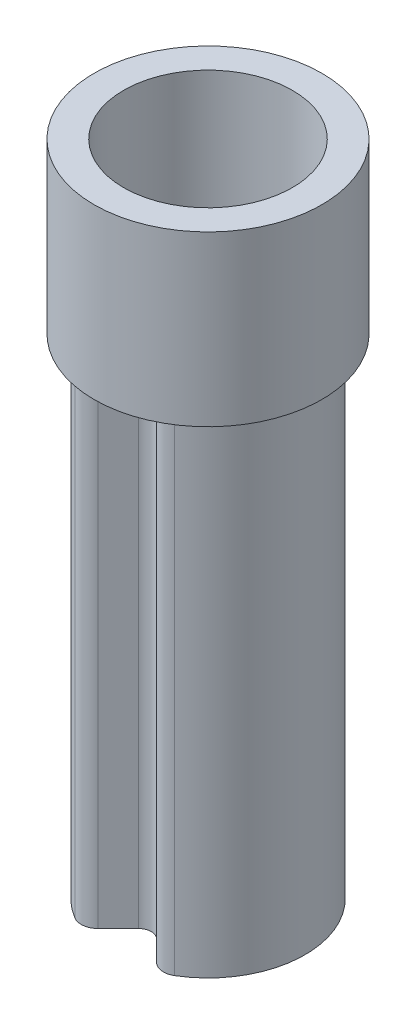
ISO-10303-21;
HEADER;
FILE_DESCRIPTION(('STEP AP214'),'2;1');
FILE_NAME('part.step','',(''),(''),'','','');
FILE_SCHEMA(('AUTOMOTIVE_DESIGN { 1 0 10303 214 1 1 1 1 }'));
ENDSEC;
DATA;
#1=APPLICATION_CONTEXT('core data for automotive mechanical design processes');
#2=APPLICATION_PROTOCOL_DEFINITION('international standard','automotive_design',2000,#1);
#3=PRODUCT_CONTEXT('',#1,'mechanical');
#4=PRODUCT('Part','Part','',(#3));
#5=PRODUCT_RELATED_PRODUCT_CATEGORY('part','',(#4));
#6=PRODUCT_DEFINITION_FORMATION('','',#4);
#7=PRODUCT_DEFINITION_CONTEXT('part definition',#1,'design');
#8=PRODUCT_DEFINITION('design','',#6,#7);
#9=PRODUCT_DEFINITION_SHAPE('','',#8);
#10=(LENGTH_UNIT() NAMED_UNIT(*) SI_UNIT(.MILLI.,.METRE.));
#11=(NAMED_UNIT(*) PLANE_ANGLE_UNIT() SI_UNIT($,.RADIAN.));
#12=(NAMED_UNIT(*) SI_UNIT($,.STERADIAN.) SOLID_ANGLE_UNIT());
#13=UNCERTAINTY_MEASURE_WITH_UNIT(LENGTH_MEASURE(1.E-05),#10,'distance_accuracy_value','');
#14=(GEOMETRIC_REPRESENTATION_CONTEXT(3) GLOBAL_UNCERTAINTY_ASSIGNED_CONTEXT((#13)) GLOBAL_UNIT_ASSIGNED_CONTEXT((#10,
#11,#12)) REPRESENTATION_CONTEXT('',''));
#15=CARTESIAN_POINT('',(0.,0.,0.));
#16=DIRECTION('',(0.,0.,1.));
#17=DIRECTION('',(1.,0.,0.));
#18=AXIS2_PLACEMENT_3D('',#15,#16,#17);
#19=CARTESIAN_POINT('',(0.,5.8,0.822132034355964));
#20=DIRECTION('',(0.,1.,0.));
#21=DIRECTION('',(0.,0.,1.));
#22=AXIS2_PLACEMENT_3D('',#19,#20,#21);
#23=PLANE('',#22);
#24=DIRECTION('',(0.707106781186548,0.,0.707106781186548));
#25=VECTOR('',#24,1.);
#26=CARTESIAN_POINT('',(0.106066017177983,5.8,0.716066017177983));
#27=LINE('',#26,#25);
#28=CARTESIAN_POINT('',(0.106066017177983,5.8,0.716066017177983));
#29=VERTEX_POINT('',#28);
#30=CARTESIAN_POINT('',(0.332945922473057,5.8,0.942945922473057));
#31=VERTEX_POINT('',#30);
#32=EDGE_CURVE('E152',#29,#31,#27,.T.);
#33=ORIENTED_EDGE('',*,*,#32,.T.);
#34=CARTESIAN_POINT('',(0.,5.8,0.));
#35=DIRECTION('',(0.,1.,0.));
#36=DIRECTION('',(0.,0.,1.));
#37=AXIS2_PLACEMENT_3D('',#34,#35,#36);
#38=CIRCLE('',#37,1.);
#39=CARTESIAN_POINT('',(0.513633561053512,5.8,0.858009653185492));
#40=VERTEX_POINT('',#39);
#41=EDGE_CURVE('E135',#31,#40,#38,.T.);
#42=ORIENTED_EDGE('',*,*,#41,.T.);
#43=CARTESIAN_POINT('',(0.487951883000837,5.8,0.815109170526217));
#44=DIRECTION('',(0.,1.,0.));
#45=DIRECTION('',(0.,0.,1.));
#46=AXIS2_PLACEMENT_3D('',#43,#44,#45);
#47=CIRCLE('',#46,0.05);
#48=CARTESIAN_POINT('',(0.452596543941509,5.8,0.850464509585545));
#49=VERTEX_POINT('',#48);
#50=EDGE_CURVE('E192',#40,#49,#47,.F.);
#51=ORIENTED_EDGE('',*,*,#50,.T.);
#52=DIRECTION('',(0.707106781186548,0.,0.707106781186547));
#53=VECTOR('',#52,1.);
#54=CARTESIAN_POINT('',(0.212132034355966,5.8,0.610000000000001));
#55=LINE('',#54,#53);
#56=CARTESIAN_POINT('',(0.212132034355966,5.8,0.610000000000002));
#57=VERTEX_POINT('',#56);
#58=EDGE_CURVE('E225',#57,#49,#55,.T.);
#59=ORIENTED_EDGE('',*,*,#58,.F.);
#60=CARTESIAN_POINT('',(0.,5.8,0.822132034355964));
#61=DIRECTION('',(0.,-1.,0.));
#62=DIRECTION('',(0.,0.,1.));
#63=AXIS2_PLACEMENT_3D('',#60,#61,#62);
#64=CIRCLE('',#63,0.3);
#65=CARTESIAN_POINT('',(-0.212132034355965,5.8,0.610000000000001));
#66=VERTEX_POINT('',#65);
#67=EDGE_CURVE('E221',#66,#57,#64,.T.);
#68=ORIENTED_EDGE('',*,*,#67,.F.);
#69=DIRECTION('',(0.707106781186547,0.,-0.707106781186548));
#70=VECTOR('',#69,1.);
#71=CARTESIAN_POINT('',(-0.479612456619358,5.8,0.877480422263394));
#72=LINE('',#71,#70);
#73=CARTESIAN_POINT('',(-0.452596543941509,5.8,0.850464509585545));
#74=VERTEX_POINT('',#73);
#75=EDGE_CURVE('E219',#74,#66,#72,.T.);
#76=ORIENTED_EDGE('',*,*,#75,.F.);
#77=CARTESIAN_POINT('',(-0.487951883000836,5.8,0.815109170526218));
#78=DIRECTION('',(0.,1.,0.));
#79=DIRECTION('',(0.,0.,1.));
#80=AXIS2_PLACEMENT_3D('',#77,#78,#79);
#81=CIRCLE('',#80,0.05);
#82=CARTESIAN_POINT('',(-0.513633561053512,5.8,0.858009653185492));
#83=VERTEX_POINT('',#82);
#84=EDGE_CURVE('E195',#74,#83,#81,.F.);
#85=ORIENTED_EDGE('',*,*,#84,.T.);
#86=CARTESIAN_POINT('',(-0.332945922473057,5.8,0.942945922473057));
#87=VERTEX_POINT('',#86);
#88=EDGE_CURVE('E12',#83,#87,#38,.T.);
#89=ORIENTED_EDGE('',*,*,#88,.T.);
#90=DIRECTION('',(0.707106781186547,0.,-0.707106781186548));
#91=VECTOR('',#90,1.);
#92=CARTESIAN_POINT('',(-0.448807004477936,5.8,1.05880700447794));
#93=LINE('',#92,#91);
#94=CARTESIAN_POINT('',(-0.106066017177983,5.8,0.716066017177983));
#95=VERTEX_POINT('',#94);
#96=EDGE_CURVE('E162',#87,#95,#93,.T.);
#97=ORIENTED_EDGE('',*,*,#96,.T.);
#98=CARTESIAN_POINT('',(0.,5.8,0.822132034355964));
#99=DIRECTION('',(0.,-1.,0.));
#100=DIRECTION('',(0.,0.,1.));
#101=AXIS2_PLACEMENT_3D('',#98,#99,#100);
#102=CIRCLE('',#101,0.15);
#103=EDGE_CURVE('E157',#95,#29,#102,.T.);
#104=ORIENTED_EDGE('',*,*,#103,.T.);
#105=EDGE_LOOP('',(#33,#42,#51,#59,#68,#76,#85,#89,#97,#104));
#106=FACE_BOUND('',#105,.T.);
#107=ADVANCED_FACE('F34',(#106),#23,.T.);
#108=CARTESIAN_POINT('',(0.,0.,0.822132034355964));
#109=DIRECTION('',(0.,1.,0.));
#110=DIRECTION('',(0.,0.,1.));
#111=AXIS2_PLACEMENT_3D('',#108,#109,#110);
#112=PLANE('',#111);
#113=CARTESIAN_POINT('',(0.,0.,0.));
#114=DIRECTION('',(0.,1.,0.));
#115=DIRECTION('',(0.,0.,1.));
#116=AXIS2_PLACEMENT_3D('',#113,#114,#115);
#117=CIRCLE('',#116,1.15);
#118=CARTESIAN_POINT('',(0.590678595211539,0.,0.986711101163316));
#119=VERTEX_POINT('',#118);
#120=CARTESIAN_POINT('',(-0.590678595211538,0.,0.986711101163316));
#121=VERTEX_POINT('',#120);
#122=EDGE_CURVE('E175',#119,#121,#117,.T.);
#123=ORIENTED_EDGE('',*,*,#122,.F.);
#124=CARTESIAN_POINT('',(0.487951883000836,0.,0.815109170526217));
#125=DIRECTION('',(0.,1.,0.));
#126=DIRECTION('',(0.,0.,1.));
#127=AXIS2_PLACEMENT_3D('',#124,#125,#126);
#128=CIRCLE('',#127,0.2);
#129=CARTESIAN_POINT('',(0.346530526763527,0.,0.956530526763527));
#130=VERTEX_POINT('',#129);
#131=EDGE_CURVE('E59',#119,#130,#128,.F.);
#132=ORIENTED_EDGE('',*,*,#131,.T.);
#133=DIRECTION('',(0.707106781186548,0.,0.707106781186548));
#134=VECTOR('',#133,1.);
#135=CARTESIAN_POINT('',(0.106066017177983,0.,0.716066017177983));
#136=LINE('',#135,#134);
#137=CARTESIAN_POINT('',(0.106066017177983,0.,0.716066017177983));
#138=VERTEX_POINT('',#137);
#139=EDGE_CURVE('E172',#138,#130,#136,.T.);
#140=ORIENTED_EDGE('',*,*,#139,.F.);
#141=CARTESIAN_POINT('',(0.,0.,0.822132034355964));
#142=DIRECTION('',(0.,-1.,0.));
#143=DIRECTION('',(0.,0.,1.));
#144=AXIS2_PLACEMENT_3D('',#141,#142,#143);
#145=CIRCLE('',#144,0.15);
#146=CARTESIAN_POINT('',(-0.106066017177983,0.,0.716066017177983));
#147=VERTEX_POINT('',#146);
#148=EDGE_CURVE('E169',#147,#138,#145,.T.);
#149=ORIENTED_EDGE('',*,*,#148,.F.);
#150=DIRECTION('',(0.707106781186547,0.,-0.707106781186548));
#151=VECTOR('',#150,1.);
#152=CARTESIAN_POINT('',(-0.448807004477936,0.,1.05880700447794));
#153=LINE('',#152,#151);
#154=CARTESIAN_POINT('',(-0.346530526763527,0.,0.956530526763527));
#155=VERTEX_POINT('',#154);
#156=EDGE_CURVE('E178',#155,#147,#153,.T.);
#157=ORIENTED_EDGE('',*,*,#156,.F.);
#158=CARTESIAN_POINT('',(-0.487951883000836,0.,0.815109170526218));
#159=DIRECTION('',(0.,1.,0.));
#160=DIRECTION('',(0.,0.,1.));
#161=AXIS2_PLACEMENT_3D('',#158,#159,#160);
#162=CIRCLE('',#161,0.2);
#163=EDGE_CURVE('E202',#155,#121,#162,.F.);
#164=ORIENTED_EDGE('',*,*,#163,.T.);
#165=EDGE_LOOP('',(#123,#132,#140,#149,#157,#164));
#166=FACE_BOUND('',#165,.T.);
#167=DIRECTION('',(0.707106781186548,0.,0.707106781186547));
#168=VECTOR('',#167,1.);
#169=CARTESIAN_POINT('',(0.212132034355966,0.,0.610000000000001));
#170=LINE('',#169,#168);
#171=CARTESIAN_POINT('',(0.212132034355966,0.,0.610000000000002));
#172=VERTEX_POINT('',#171);
#173=CARTESIAN_POINT('',(0.452596543941509,0.,0.850464509585545));
#174=VERTEX_POINT('',#173);
#175=EDGE_CURVE('E222',#172,#174,#170,.T.);
#176=ORIENTED_EDGE('',*,*,#175,.T.);
#177=CARTESIAN_POINT('',(0.487951883000837,0.,0.815109170526217));
#178=DIRECTION('',(0.,1.,0.));
#179=DIRECTION('',(0.,0.,1.));
#180=AXIS2_PLACEMENT_3D('',#177,#178,#179);
#181=CIRCLE('',#180,0.05);
#182=CARTESIAN_POINT('',(0.513633561053512,0.,0.858009653185492));
#183=VERTEX_POINT('',#182);
#184=EDGE_CURVE('E190',#174,#183,#181,.T.);
#185=ORIENTED_EDGE('',*,*,#184,.T.);
#186=CARTESIAN_POINT('',(0.,0.,0.));
#187=DIRECTION('',(0.,1.,0.));
#188=DIRECTION('',(0.,0.,1.));
#189=AXIS2_PLACEMENT_3D('',#186,#187,#188);
#190=CIRCLE('',#189,1.);
#191=CARTESIAN_POINT('',(-0.513633561053512,0.,0.858009653185492));
#192=VERTEX_POINT('',#191);
#193=EDGE_CURVE('E229',#183,#192,#190,.T.);
#194=ORIENTED_EDGE('',*,*,#193,.T.);
#195=CARTESIAN_POINT('',(-0.487951883000836,0.,0.815109170526218));
#196=DIRECTION('',(0.,1.,0.));
#197=DIRECTION('',(0.,0.,1.));
#198=AXIS2_PLACEMENT_3D('',#195,#196,#197);
#199=CIRCLE('',#198,0.05);
#200=CARTESIAN_POINT('',(-0.452596543941509,0.,0.850464509585545));
#201=VERTEX_POINT('',#200);
#202=EDGE_CURVE('E193',#192,#201,#199,.T.);
#203=ORIENTED_EDGE('',*,*,#202,.T.);
#204=DIRECTION('',(0.707106781186547,0.,-0.707106781186548));
#205=VECTOR('',#204,1.);
#206=CARTESIAN_POINT('',(-0.479612456619358,0.,0.877480422263394));
#207=LINE('',#206,#205);
#208=CARTESIAN_POINT('',(-0.212132034355965,0.,0.610000000000001));
#209=VERTEX_POINT('',#208);
#210=EDGE_CURVE('E232',#201,#209,#207,.T.);
#211=ORIENTED_EDGE('',*,*,#210,.T.);
#212=CARTESIAN_POINT('',(0.,0.,0.822132034355964));
#213=DIRECTION('',(0.,-1.,0.));
#214=DIRECTION('',(0.,0.,1.));
#215=AXIS2_PLACEMENT_3D('',#212,#213,#214);
#216=CIRCLE('',#215,0.3);
#217=EDGE_CURVE('E235',#209,#172,#216,.T.);
#218=ORIENTED_EDGE('',*,*,#217,.T.);
#219=EDGE_LOOP('',(#176,#185,#194,#203,#211,#218));
#220=FACE_BOUND('',#219,.T.);
#221=ADVANCED_FACE('F253',(#166,#220),#112,.F.);
#222=CARTESIAN_POINT('',(0.,5.8,0.822132034355964));
#223=DIRECTION('',(0.,-1.,0.));
#224=DIRECTION('',(0.,0.,-1.));
#225=AXIS2_PLACEMENT_3D('',#222,#223,#224);
#226=CYLINDRICAL_SURFACE('',#225,0.15);
#227=ORIENTED_EDGE('',*,*,#148,.T.);
#228=DIRECTION('',(0.,-1.,0.));
#229=VECTOR('',#228,1.);
#230=CARTESIAN_POINT('',(0.106066017177983,5.8,0.716066017177983));
#231=LINE('',#230,#229);
#232=EDGE_CURVE('E182',#29,#138,#231,.T.);
#233=ORIENTED_EDGE('',*,*,#232,.F.);
#234=ORIENTED_EDGE('',*,*,#103,.F.);
#235=DIRECTION('',(0.,-1.,0.));
#236=VECTOR('',#235,1.);
#237=CARTESIAN_POINT('',(-0.106066017177983,5.8,0.716066017177983));
#238=LINE('',#237,#236);
#239=EDGE_CURVE('E168',#95,#147,#238,.T.);
#240=ORIENTED_EDGE('',*,*,#239,.T.);
#241=EDGE_LOOP('',(#227,#233,#234,#240));
#242=FACE_BOUND('',#241,.T.);
#243=ADVANCED_FACE('F289',(#242),#226,.F.);
#244=CARTESIAN_POINT('',(0.106066017177983,5.8,0.716066017177983));
#245=DIRECTION('',(0.707106781186547,0.,-0.707106781186547));
#246=DIRECTION('',(-0.707106781186548,0.,-0.707106781186548));
#247=AXIS2_PLACEMENT_3D('',#244,#245,#246);
#248=PLANE('',#247);
#249=ORIENTED_EDGE('',*,*,#139,.T.);
#250=DIRECTION('',(0.,-1.,0.));
#251=VECTOR('',#250,1.);
#252=CARTESIAN_POINT('',(0.346530526763527,5.8,0.956530526763527));
#253=LINE('',#252,#251);
#254=CARTESIAN_POINT('',(0.346530526763527,5.8,0.956530526763527));
#255=VERTEX_POINT('',#254);
#256=EDGE_CURVE('E155',#130,#255,#253,.F.);
#257=ORIENTED_EDGE('',*,*,#256,.T.);
#258=EDGE_CURVE('E131',#31,#255,#27,.T.);
#259=ORIENTED_EDGE('',*,*,#258,.F.);
#260=ORIENTED_EDGE('',*,*,#32,.F.);
#261=ORIENTED_EDGE('',*,*,#232,.T.);
#262=EDGE_LOOP('',(#249,#257,#259,#260,#261));
#263=FACE_BOUND('',#262,.T.);
#264=ADVANCED_FACE('F150',(#263),#248,.F.);
#265=CARTESIAN_POINT('',(0.,5.8,0.));
#266=DIRECTION('',(0.,-1.,0.));
#267=DIRECTION('',(0.,0.,-1.));
#268=AXIS2_PLACEMENT_3D('',#265,#266,#267);
#269=CYLINDRICAL_SURFACE('',#268,1.15);
#270=CARTESIAN_POINT('',(0.,5.8,0.));
#271=DIRECTION('',(0.,1.,0.));
#272=DIRECTION('',(0.,0.,1.));
#273=AXIS2_PLACEMENT_3D('',#270,#271,#272);
#274=CIRCLE('',#273,1.15);
#275=CARTESIAN_POINT('',(0.590678595211539,5.8,0.986711101163316));
#276=VERTEX_POINT('',#275);
#277=CARTESIAN_POINT('',(-0.590678595211538,5.8,0.986711101163316));
#278=VERTEX_POINT('',#277);
#279=EDGE_CURVE('E161',#276,#278,#274,.T.);
#280=ORIENTED_EDGE('',*,*,#279,.F.);
#281=DIRECTION('',(0.,-1.,0.));
#282=VECTOR('',#281,1.);
#283=CARTESIAN_POINT('',(0.590678595211539,5.8,0.986711101163316));
#284=LINE('',#283,#282);
#285=EDGE_CURVE('E199',#276,#119,#284,.T.);
#286=ORIENTED_EDGE('',*,*,#285,.T.);
#287=ORIENTED_EDGE('',*,*,#122,.T.);
#288=DIRECTION('',(0.,-1.,0.));
#289=VECTOR('',#288,1.);
#290=CARTESIAN_POINT('',(-0.590678595211539,5.8,0.986711101163316));
#291=LINE('',#290,#289);
#292=EDGE_CURVE('E196',#121,#278,#291,.F.);
#293=ORIENTED_EDGE('',*,*,#292,.T.);
#294=EDGE_LOOP('',(#280,#286,#287,#293));
#295=FACE_BOUND('',#294,.T.);
#296=ADVANCED_FACE('F297',(#295),#269,.T.);
#297=CARTESIAN_POINT('',(-0.448807004477936,5.8,1.05880700447794));
#298=DIRECTION('',(-0.707106781186548,0.,-0.707106781186547));
#299=DIRECTION('',(-0.707106781186547,0.,0.707106781186548));
#300=AXIS2_PLACEMENT_3D('',#297,#298,#299);
#301=PLANE('',#300);
#302=CARTESIAN_POINT('',(-0.346530526763527,5.8,0.956530526763527));
#303=VERTEX_POINT('',#302);
#304=EDGE_CURVE('E134',#303,#87,#93,.T.);
#305=ORIENTED_EDGE('',*,*,#304,.F.);
#306=DIRECTION('',(0.,-1.,0.));
#307=VECTOR('',#306,1.);
#308=CARTESIAN_POINT('',(-0.346530526763527,5.8,0.956530526763527));
#309=LINE('',#308,#307);
#310=EDGE_CURVE('E43',#303,#155,#309,.T.);
#311=ORIENTED_EDGE('',*,*,#310,.T.);
#312=ORIENTED_EDGE('',*,*,#156,.T.);
#313=ORIENTED_EDGE('',*,*,#239,.F.);
#314=ORIENTED_EDGE('',*,*,#96,.F.);
#315=EDGE_LOOP('',(#305,#311,#312,#313,#314));
#316=FACE_BOUND('',#315,.T.);
#317=ADVANCED_FACE('F294',(#316),#301,.F.);
#318=CARTESIAN_POINT('',(0.,5.8,0.));
#319=DIRECTION('',(0.,-1.,0.));
#320=DIRECTION('',(0.,0.,-1.));
#321=AXIS2_PLACEMENT_3D('',#318,#319,#320);
#322=CYLINDRICAL_SURFACE('',#321,1.);
#323=ORIENTED_EDGE('',*,*,#193,.F.);
#324=DIRECTION('',(0.,-1.,0.));
#325=VECTOR('',#324,1.);
#326=CARTESIAN_POINT('',(0.513633561053512,5.8,0.858009653185492));
#327=LINE('',#326,#325);
#328=EDGE_CURVE('E143',#183,#40,#327,.F.);
#329=ORIENTED_EDGE('',*,*,#328,.T.);
#330=ORIENTED_EDGE('',*,*,#41,.F.);
#331=EDGE_CURVE('E51',#87,#31,#38,.T.);
#332=ORIENTED_EDGE('',*,*,#331,.F.);
#333=ORIENTED_EDGE('',*,*,#88,.F.);
#334=DIRECTION('',(0.,-1.,0.));
#335=VECTOR('',#334,1.);
#336=CARTESIAN_POINT('',(-0.513633561053512,5.8,0.858009653185492));
#337=LINE('',#336,#335);
#338=EDGE_CURVE('E187',#83,#192,#337,.T.);
#339=ORIENTED_EDGE('',*,*,#338,.T.);
#340=EDGE_LOOP('',(#323,#329,#330,#332,#333,#339));
#341=FACE_BOUND('',#340,.T.);
#342=CARTESIAN_POINT('',(0.,7.8,0.));
#343=DIRECTION('',(0.,1.,0.));
#344=DIRECTION('',(0.,0.,1.));
#345=AXIS2_PLACEMENT_3D('',#342,#343,#344);
#346=CIRCLE('',#345,1.);
#347=CARTESIAN_POINT('',(0.,7.8,1.));
#348=VERTEX_POINT('',#347);
#349=EDGE_CURVE('E136',#348,#348,#346,.T.);
#350=ORIENTED_EDGE('',*,*,#349,.T.);
#351=EDGE_LOOP('',(#350));
#352=FACE_BOUND('',#351,.T.);
#353=ADVANCED_FACE('F140',(#341,#352),#322,.F.);
#354=CARTESIAN_POINT('',(-0.479612456619358,5.8,0.877480422263394));
#355=DIRECTION('',(-0.707106781186548,0.,-0.707106781186547));
#356=DIRECTION('',(-0.707106781186547,0.,0.707106781186548));
#357=AXIS2_PLACEMENT_3D('',#354,#355,#356);
#358=PLANE('',#357);
#359=ORIENTED_EDGE('',*,*,#210,.F.);
#360=DIRECTION('',(0.,1.,0.));
#361=VECTOR('',#360,1.);
#362=CARTESIAN_POINT('',(-0.452596543941509,5.8,0.850464509585545));
#363=LINE('',#362,#361);
#364=EDGE_CURVE('E188',#201,#74,#363,.T.);
#365=ORIENTED_EDGE('',*,*,#364,.T.);
#366=ORIENTED_EDGE('',*,*,#75,.T.);
#367=DIRECTION('',(0.,-1.,0.));
#368=VECTOR('',#367,1.);
#369=CARTESIAN_POINT('',(-0.212132034355965,5.8,0.610000000000001));
#370=LINE('',#369,#368);
#371=EDGE_CURVE('E173',#66,#209,#370,.T.);
#372=ORIENTED_EDGE('',*,*,#371,.T.);
#373=EDGE_LOOP('',(#359,#365,#366,#372));
#374=FACE_BOUND('',#373,.T.);
#375=ADVANCED_FACE('F245',(#374),#358,.T.);
#376=CARTESIAN_POINT('',(0.,5.8,0.822132034355964));
#377=DIRECTION('',(0.,-1.,0.));
#378=DIRECTION('',(0.,0.,-1.));
#379=AXIS2_PLACEMENT_3D('',#376,#377,#378);
#380=CYLINDRICAL_SURFACE('',#379,0.3);
#381=ORIENTED_EDGE('',*,*,#217,.F.);
#382=ORIENTED_EDGE('',*,*,#371,.F.);
#383=ORIENTED_EDGE('',*,*,#67,.T.);
#384=DIRECTION('',(0.,-1.,0.));
#385=VECTOR('',#384,1.);
#386=CARTESIAN_POINT('',(0.212132034355966,5.8,0.610000000000002));
#387=LINE('',#386,#385);
#388=EDGE_CURVE('E228',#57,#172,#387,.T.);
#389=ORIENTED_EDGE('',*,*,#388,.T.);
#390=EDGE_LOOP('',(#381,#382,#383,#389));
#391=FACE_BOUND('',#390,.T.);
#392=ADVANCED_FACE('F250',(#391),#380,.T.);
#393=CARTESIAN_POINT('',(0.212132034355966,5.8,0.610000000000001));
#394=DIRECTION('',(0.707106781186547,0.,-0.707106781186548));
#395=DIRECTION('',(-0.707106781186548,0.,-0.707106781186547));
#396=AXIS2_PLACEMENT_3D('',#393,#394,#395);
#397=PLANE('',#396);
#398=ORIENTED_EDGE('',*,*,#58,.T.);
#399=DIRECTION('',(0.,1.,0.));
#400=VECTOR('',#399,1.);
#401=CARTESIAN_POINT('',(0.452596543941509,0.,0.850464509585545));
#402=LINE('',#401,#400);
#403=EDGE_CURVE('E184',#49,#174,#402,.F.);
#404=ORIENTED_EDGE('',*,*,#403,.T.);
#405=ORIENTED_EDGE('',*,*,#175,.F.);
#406=ORIENTED_EDGE('',*,*,#388,.F.);
#407=EDGE_LOOP('',(#398,#404,#405,#406));
#408=FACE_BOUND('',#407,.T.);
#409=ADVANCED_FACE('F272',(#408),#397,.T.);
#410=CARTESIAN_POINT('',(0.487951883000837,5.8,0.815109170526217));
#411=DIRECTION('',(0.,-1.,0.));
#412=DIRECTION('',(0.,0.,-1.));
#413=AXIS2_PLACEMENT_3D('',#410,#411,#412);
#414=CYLINDRICAL_SURFACE('',#413,0.05);
#415=ORIENTED_EDGE('',*,*,#50,.F.);
#416=ORIENTED_EDGE('',*,*,#328,.F.);
#417=ORIENTED_EDGE('',*,*,#184,.F.);
#418=ORIENTED_EDGE('',*,*,#403,.F.);
#419=EDGE_LOOP('',(#415,#416,#417,#418));
#420=FACE_BOUND('',#419,.T.);
#421=ADVANCED_FACE('F273',(#420),#414,.F.);
#422=CARTESIAN_POINT('',(-0.487951883000836,5.8,0.815109170526218));
#423=DIRECTION('',(0.,-1.,0.));
#424=DIRECTION('',(0.,0.,-1.));
#425=AXIS2_PLACEMENT_3D('',#422,#423,#424);
#426=CYLINDRICAL_SURFACE('',#425,0.05);
#427=ORIENTED_EDGE('',*,*,#84,.F.);
#428=ORIENTED_EDGE('',*,*,#364,.F.);
#429=ORIENTED_EDGE('',*,*,#202,.F.);
#430=ORIENTED_EDGE('',*,*,#338,.F.);
#431=EDGE_LOOP('',(#427,#428,#429,#430));
#432=FACE_BOUND('',#431,.T.);
#433=ADVANCED_FACE('F258',(#432),#426,.F.);
#434=CARTESIAN_POINT('',(0.487951883000836,5.8,0.815109170526217));
#435=DIRECTION('',(0.,-1.,0.));
#436=DIRECTION('',(0.,0.,-1.));
#437=AXIS2_PLACEMENT_3D('',#434,#435,#436);
#438=CYLINDRICAL_SURFACE('',#437,0.2);
#439=CARTESIAN_POINT('',(0.487951883000836,5.8,0.815109170526217));
#440=DIRECTION('',(0.,1.,0.));
#441=DIRECTION('',(0.,0.,1.));
#442=AXIS2_PLACEMENT_3D('',#439,#440,#441);
#443=CIRCLE('',#442,0.2);
#444=EDGE_CURVE('E208',#255,#276,#443,.T.);
#445=ORIENTED_EDGE('',*,*,#444,.F.);
#446=ORIENTED_EDGE('',*,*,#256,.F.);
#447=ORIENTED_EDGE('',*,*,#131,.F.);
#448=ORIENTED_EDGE('',*,*,#285,.F.);
#449=EDGE_LOOP('',(#445,#446,#447,#448));
#450=FACE_BOUND('',#449,.T.);
#451=ADVANCED_FACE('F280',(#450),#438,.T.);
#452=CARTESIAN_POINT('',(-0.487951883000836,5.8,0.815109170526218));
#453=DIRECTION('',(0.,-1.,0.));
#454=DIRECTION('',(0.,0.,-1.));
#455=AXIS2_PLACEMENT_3D('',#452,#453,#454);
#456=CYLINDRICAL_SURFACE('',#455,0.2);
#457=CARTESIAN_POINT('',(-0.487951883000836,5.8,0.815109170526218));
#458=DIRECTION('',(0.,1.,0.));
#459=DIRECTION('',(0.,0.,1.));
#460=AXIS2_PLACEMENT_3D('',#457,#458,#459);
#461=CIRCLE('',#460,0.2);
#462=EDGE_CURVE('E206',#278,#303,#461,.T.);
#463=ORIENTED_EDGE('',*,*,#462,.F.);
#464=ORIENTED_EDGE('',*,*,#292,.F.);
#465=ORIENTED_EDGE('',*,*,#163,.F.);
#466=ORIENTED_EDGE('',*,*,#310,.F.);
#467=EDGE_LOOP('',(#463,#464,#465,#466));
#468=FACE_BOUND('',#467,.T.);
#469=ADVANCED_FACE('F36',(#468),#456,.T.);
#470=CARTESIAN_POINT('',(0.,5.8,0.));
#471=DIRECTION('',(0.,1.,0.));
#472=DIRECTION('',(0.,0.,1.));
#473=AXIS2_PLACEMENT_3D('',#470,#471,#472);
#474=PLANE('',#473);
#475=CARTESIAN_POINT('',(0.,5.8,0.));
#476=DIRECTION('',(0.,1.,0.));
#477=DIRECTION('',(0.,0.,1.));
#478=AXIS2_PLACEMENT_3D('',#475,#476,#477);
#479=CIRCLE('',#478,1.35);
#480=CARTESIAN_POINT('',(0.,5.8,-1.35));
#481=VERTEX_POINT('',#480);
#482=EDGE_CURVE('E147',#481,#481,#479,.T.);
#483=ORIENTED_EDGE('',*,*,#482,.F.);
#484=EDGE_LOOP('',(#483));
#485=FACE_BOUND('',#484,.T.);
#486=ORIENTED_EDGE('',*,*,#331,.T.);
#487=ORIENTED_EDGE('',*,*,#258,.T.);
#488=ORIENTED_EDGE('',*,*,#444,.T.);
#489=ORIENTED_EDGE('',*,*,#279,.T.);
#490=ORIENTED_EDGE('',*,*,#462,.T.);
#491=ORIENTED_EDGE('',*,*,#304,.T.);
#492=EDGE_LOOP('',(#486,#487,#488,#489,#490,#491));
#493=FACE_BOUND('',#492,.T.);
#494=ADVANCED_FACE('F129',(#485,#493),#474,.F.);
#495=CARTESIAN_POINT('',(0.,19.4183766184074,0.));
#496=DIRECTION('',(0.,-1.,0.));
#497=DIRECTION('',(0.,0.,-1.));
#498=AXIS2_PLACEMENT_3D('',#495,#496,#497);
#499=CYLINDRICAL_SURFACE('',#498,1.35);
#500=CARTESIAN_POINT('',(0.,7.8,0.));
#501=DIRECTION('',(0.,1.,0.));
#502=DIRECTION('',(0.,0.,1.));
#503=AXIS2_PLACEMENT_3D('',#500,#501,#502);
#504=CIRCLE('',#503,1.35);
#505=CARTESIAN_POINT('',(0.,7.8,-1.35));
#506=VERTEX_POINT('',#505);
#507=EDGE_CURVE('E233',#506,#506,#504,.T.);
#508=CARTESIAN_POINT('',(0.,5.8,-1.35));
#509=CARTESIAN_POINT('',(0.,5.82083333333333,-1.35));
#510=CARTESIAN_POINT('',(0.,5.84166666666666,-1.35));
#511=CARTESIAN_POINT('',(0.,5.88333333333333,-1.35));
#512=CARTESIAN_POINT('',(0.,5.90416666666666,-1.35));
#513=CARTESIAN_POINT('',(0.,5.94583333333333,-1.35));
#514=CARTESIAN_POINT('',(0.,5.96666666666666,-1.35));
#515=CARTESIAN_POINT('',(0.,6.00833333333333,-1.35));
#516=CARTESIAN_POINT('',(0.,6.02916666666666,-1.35));
#517=CARTESIAN_POINT('',(0.,6.07083333333333,-1.35));
#518=CARTESIAN_POINT('',(0.,6.09166666666666,-1.35));
#519=CARTESIAN_POINT('',(0.,6.13333333333333,-1.35));
#520=CARTESIAN_POINT('',(0.,6.15416666666666,-1.35));
#521=CARTESIAN_POINT('',(0.,6.19583333333333,-1.35));
#522=CARTESIAN_POINT('',(0.,6.21666666666667,-1.35));
#523=CARTESIAN_POINT('',(0.,6.25833333333333,-1.35));
#524=CARTESIAN_POINT('',(0.,6.27916666666667,-1.35));
#525=CARTESIAN_POINT('',(0.,6.32083333333333,-1.35));
#526=CARTESIAN_POINT('',(0.,6.34166666666667,-1.35));
#527=CARTESIAN_POINT('',(0.,6.38333333333333,-1.35));
#528=CARTESIAN_POINT('',(0.,6.40416666666667,-1.35));
#529=CARTESIAN_POINT('',(0.,6.44583333333333,-1.35));
#530=CARTESIAN_POINT('',(0.,6.46666666666667,-1.35));
#531=CARTESIAN_POINT('',(0.,6.50833333333333,-1.35));
#532=CARTESIAN_POINT('',(0.,6.52916666666667,-1.35));
#533=CARTESIAN_POINT('',(0.,6.57083333333333,-1.35));
#534=CARTESIAN_POINT('',(0.,6.59166666666667,-1.35));
#535=CARTESIAN_POINT('',(0.,6.63333333333333,-1.35));
#536=CARTESIAN_POINT('',(0.,6.65416666666667,-1.35));
#537=CARTESIAN_POINT('',(0.,6.69583333333333,-1.35));
#538=CARTESIAN_POINT('',(0.,6.71666666666667,-1.35));
#539=CARTESIAN_POINT('',(0.,6.75833333333333,-1.35));
#540=CARTESIAN_POINT('',(0.,6.77916666666667,-1.35));
#541=CARTESIAN_POINT('',(0.,6.82083333333333,-1.35));
#542=CARTESIAN_POINT('',(0.,6.84166666666667,-1.35));
#543=CARTESIAN_POINT('',(0.,6.88333333333333,-1.35));
#544=CARTESIAN_POINT('',(0.,6.90416666666667,-1.35));
#545=CARTESIAN_POINT('',(0.,6.94583333333333,-1.35));
#546=CARTESIAN_POINT('',(0.,6.96666666666667,-1.35));
#547=CARTESIAN_POINT('',(0.,7.00833333333333,-1.35));
#548=CARTESIAN_POINT('',(0.,7.02916666666667,-1.35));
#549=CARTESIAN_POINT('',(0.,7.07083333333333,-1.35));
#550=CARTESIAN_POINT('',(0.,7.09166666666667,-1.35));
#551=CARTESIAN_POINT('',(0.,7.13333333333333,-1.35));
#552=CARTESIAN_POINT('',(0.,7.15416666666667,-1.35));
#553=CARTESIAN_POINT('',(0.,7.19583333333333,-1.35));
#554=CARTESIAN_POINT('',(0.,7.21666666666667,-1.35));
#555=CARTESIAN_POINT('',(0.,7.25833333333333,-1.35));
#556=CARTESIAN_POINT('',(0.,7.27916666666667,-1.35));
#557=CARTESIAN_POINT('',(0.,7.32083333333333,-1.35));
#558=CARTESIAN_POINT('',(0.,7.34166666666667,-1.35));
#559=CARTESIAN_POINT('',(0.,7.38333333333333,-1.35));
#560=CARTESIAN_POINT('',(0.,7.40416666666667,-1.35));
#561=CARTESIAN_POINT('',(0.,7.44583333333333,-1.35));
#562=CARTESIAN_POINT('',(0.,7.46666666666667,-1.35));
#563=CARTESIAN_POINT('',(0.,7.50833333333333,-1.35));
#564=CARTESIAN_POINT('',(0.,7.52916666666667,-1.35));
#565=CARTESIAN_POINT('',(0.,7.57083333333333,-1.35));
#566=CARTESIAN_POINT('',(0.,7.59166666666667,-1.35));
#567=CARTESIAN_POINT('',(0.,7.63333333333333,-1.35));
#568=CARTESIAN_POINT('',(0.,7.65416666666667,-1.35));
#569=CARTESIAN_POINT('',(0.,7.69583333333333,-1.35));
#570=CARTESIAN_POINT('',(0.,7.71666666666667,-1.35));
#571=CARTESIAN_POINT('',(0.,7.75833333333333,-1.35));
#572=CARTESIAN_POINT('',(0.,7.77916666666667,-1.35));
#573=CARTESIAN_POINT('',(0.,7.8,-1.35));
#574=B_SPLINE_CURVE_WITH_KNOTS('',3,(#508,#509,#510,#511,#512,#513,#514,#515,#516,#517,#518,
#519,#520,#521,#522,#523,#524,#525,#526,#527,#528,#529,#530,#531,#532,#533,#534,#535,#536,#537,
#538,#539,#540,#541,#542,#543,#544,#545,#546,#547,#548,#549,#550,#551,#552,#553,#554,#555,#556,
#557,#558,#559,#560,#561,#562,#563,#564,#565,#566,#567,#568,#569,#570,#571,#572,#573),
.UNSPECIFIED.,.F.,.F.,(4,2,2,2,2,2,2,2,2,2,2,2,2,2,2,2,2,2,2,2,2,2,2,2,2,2,2,2,2,2,2,2,4),(0.,
0.0625000000000001,0.125,0.1875,0.25,0.3125,0.375,0.4375,0.5,0.5625,0.625000000000001,
0.687500000000001,0.750000000000001,0.812500000000001,0.875000000000001,0.937500000000001,1.,
1.0625,1.125,1.1875,1.25,1.3125,1.375,1.4375,1.5,1.5625,1.625,1.6875,1.75,1.8125,1.875,1.9375,
2.),.UNSPECIFIED.);
#575=EDGE_CURVE('BSEAM323',#481,#506,#574,.T.);
#576=ORIENTED_EDGE('',*,*,#482,.T.);
#577=ORIENTED_EDGE('',*,*,#507,.F.);
#578=ORIENTED_EDGE('',*,*,#575,.T.);
#579=ORIENTED_EDGE('',*,*,#575,.F.);
#580=EDGE_LOOP('',(#576,#578,#577,#579));
#581=FACE_BOUND('',#580,.T.);
#582=ADVANCED_FACE('F323',(#581),#499,.T.);
#583=CARTESIAN_POINT('',(0.,7.8,0.822132034355964));
#584=DIRECTION('',(0.,1.,0.));
#585=DIRECTION('',(0.,0.,1.));
#586=AXIS2_PLACEMENT_3D('',#583,#584,#585);
#587=PLANE('',#586);
#588=ORIENTED_EDGE('',*,*,#349,.F.);
#589=EDGE_LOOP('',(#588));
#590=FACE_BOUND('',#589,.T.);
#591=ORIENTED_EDGE('',*,*,#507,.T.);
#592=EDGE_LOOP('',(#591));
#593=FACE_BOUND('',#592,.T.);
#594=ADVANCED_FACE('F405',(#590,#593),#587,.T.);
#595=CLOSED_SHELL('',(#107,#221,#243,#264,#296,#317,#353,#375,#392,#409,#421,#433,#451,#469,
#494,#582,#594));
#596=MANIFOLD_SOLID_BREP('B2',#595);
#597=ADVANCED_BREP_SHAPE_REPRESENTATION('',(#18,#596),#14);
#598=SHAPE_DEFINITION_REPRESENTATION(#9,#597);
ENDSEC;
END-ISO-10303-21;
